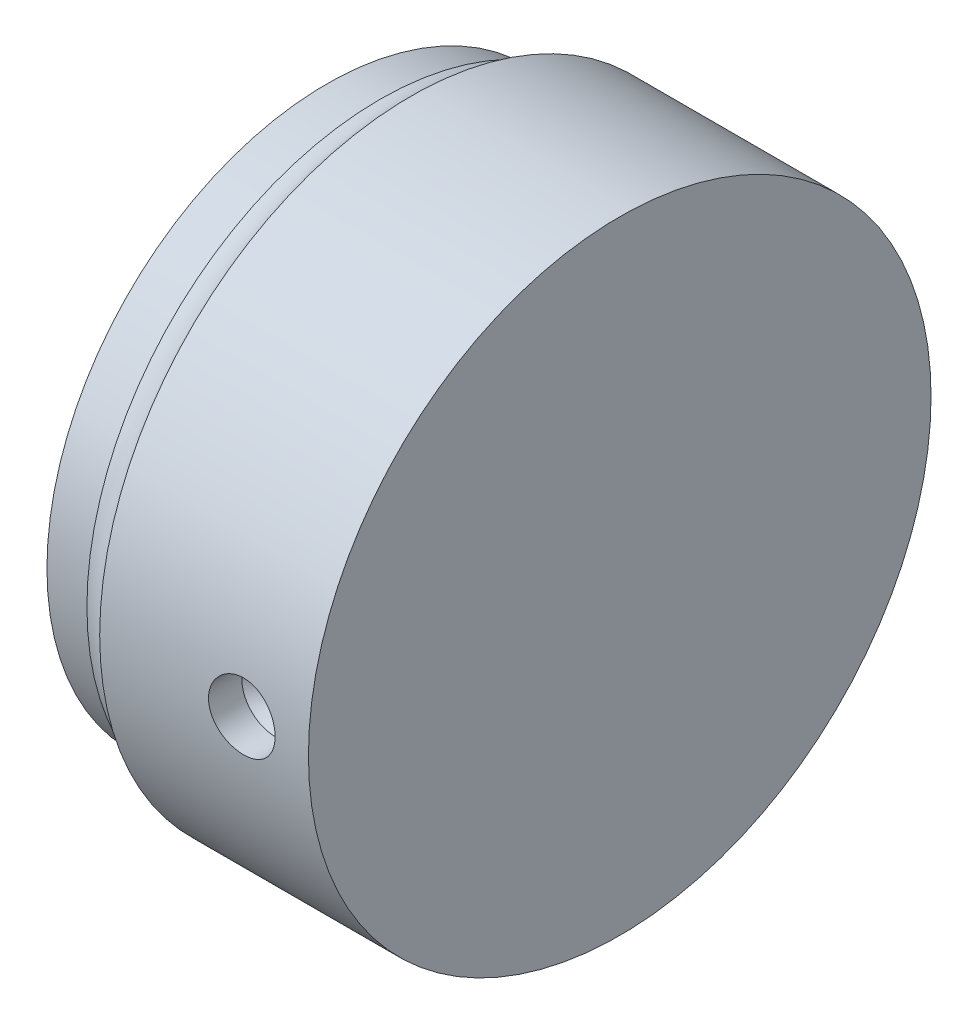
ISO-10303-21;
HEADER;
FILE_DESCRIPTION(('STEP AP214'),'2;1');
FILE_NAME('part.step','',(''),(''),'','','');
FILE_SCHEMA(('AUTOMOTIVE_DESIGN { 1 0 10303 214 1 1 1 1 }'));
ENDSEC;
DATA;
#1=APPLICATION_CONTEXT('core data for automotive mechanical design processes');
#2=APPLICATION_PROTOCOL_DEFINITION('international standard','automotive_design',2000,#1);
#3=PRODUCT_CONTEXT('',#1,'mechanical');
#4=PRODUCT('Part','Part','',(#3));
#5=PRODUCT_RELATED_PRODUCT_CATEGORY('part','',(#4));
#6=PRODUCT_DEFINITION_FORMATION('','',#4);
#7=PRODUCT_DEFINITION_CONTEXT('part definition',#1,'design');
#8=PRODUCT_DEFINITION('design','',#6,#7);
#9=PRODUCT_DEFINITION_SHAPE('','',#8);
#10=(LENGTH_UNIT() NAMED_UNIT(*) SI_UNIT(.MILLI.,.METRE.));
#11=(NAMED_UNIT(*) PLANE_ANGLE_UNIT() SI_UNIT($,.RADIAN.));
#12=(NAMED_UNIT(*) SI_UNIT($,.STERADIAN.) SOLID_ANGLE_UNIT());
#13=UNCERTAINTY_MEASURE_WITH_UNIT(LENGTH_MEASURE(1.E-05),#10,'distance_accuracy_value','');
#14=(GEOMETRIC_REPRESENTATION_CONTEXT(3) GLOBAL_UNCERTAINTY_ASSIGNED_CONTEXT((#13)) GLOBAL_UNIT_ASSIGNED_CONTEXT((#10,
#11,#12)) REPRESENTATION_CONTEXT('',''));
#15=CARTESIAN_POINT('',(0.,0.,0.));
#16=DIRECTION('',(0.,0.,1.));
#17=DIRECTION('',(1.,0.,0.));
#18=AXIS2_PLACEMENT_3D('',#15,#16,#17);
#19=CARTESIAN_POINT('',(-18.2792244551209,0.,-46.7421297434366));
#20=DIRECTION('',(0.,0.,1.00000000000003));
#21=DIRECTION('',(1.,0.,0.));
#22=AXIS2_PLACEMENT_3D('',#19,#20,#21);
#23=CYLINDRICAL_SURFACE('',#22,2.5);
#24=CARTESIAN_POINT('',(-18.2792244551209,0.,39.2411297434375));
#25=DIRECTION('',(0.,0.,1.00000000000003));
#26=DIRECTION('',(1.,0.,0.));
#27=AXIS2_PLACEMENT_3D('',#24,#25,#26);
#28=CIRCLE('',#27,2.5);
#29=CARTESIAN_POINT('',(-15.7792244551209,0.,39.2411297434375));
#30=VERTEX_POINT('',#29);
#31=EDGE_CURVE('E11',#30,#30,#28,.T.);
#32=ORIENTED_EDGE('',*,*,#31,.T.);
#33=EDGE_LOOP('',(#32));
#34=FACE_BOUND('',#33,.T.);
#35=CARTESIAN_POINT('',(-15.7792244551209,1.66533453693773E-13,3.00000000000027));
#36=CARTESIAN_POINT('',(-15.7792293406746,0.118757533193332,2.99999522795234));
#37=CARTESIAN_POINT('',(-15.7877469590255,0.237551281104216,2.9928867059475));
#38=CARTESIAN_POINT('',(-15.8211871784727,0.471182492492846,2.9651076286826));
#39=CARTESIAN_POINT('',(-15.8461219290961,0.586016959612439,2.94442702942004));
#40=CARTESIAN_POINT('',(-15.9105365724535,0.807829942407299,2.89142690238867));
#41=CARTESIAN_POINT('',(-15.9499295294746,0.914850920904895,2.8591769655007));
#42=CARTESIAN_POINT('',(-16.0412415030635,1.11984139043407,2.78529176182902));
#43=CARTESIAN_POINT('',(-16.0931647517941,1.21780780775233,2.74365332434936));
#44=CARTESIAN_POINT('',(-16.228678204929,1.43789998519766,2.63674191529867));
#45=CARTESIAN_POINT('',(-16.3168946593031,1.55568219657217,2.56840549256193));
#46=CARTESIAN_POINT('',(-16.5097487808722,1.77202398328145,2.42422624777675));
#47=CARTESIAN_POINT('',(-16.6144320243639,1.87052845158605,2.34836281453276));
#48=CARTESIAN_POINT('',(-16.7833087316119,2.00437263805587,2.23294886313739));
#49=CARTESIAN_POINT('',(-16.8421800313122,2.04699726278813,2.19383679994999));
#50=CARTESIAN_POINT('',(-16.9637300580814,2.12715295529551,2.11620611809196));
#51=CARTESIAN_POINT('',(-17.0264100499916,2.16468231743737,2.07768770195026));
#52=CARTESIAN_POINT('',(-17.1554917794565,2.23441122570744,2.00250543288664));
#53=CARTESIAN_POINT('',(-17.2218842398457,2.26662332666224,1.96583735754653));
#54=CARTESIAN_POINT('',(-17.3586707390493,2.3255369061279,1.89577686630314));
#55=CARTESIAN_POINT('',(-17.4290613024627,2.3522430799868,1.86238167220906));
#56=CARTESIAN_POINT('',(-17.580891545321,2.40193513934005,1.79791918980413));
#57=CARTESIAN_POINT('',(-17.6627485478443,2.42433807692595,1.76736311251005));
#58=CARTESIAN_POINT('',(-17.831114223934,2.461013136755,1.71593180556008));
#59=CARTESIAN_POINT('',(-17.9176110417355,2.47530499393794,1.69503310194203));
#60=CARTESIAN_POINT('',(-18.0949898635003,2.4948107279905,1.6662092896885));
#61=CARTESIAN_POINT('',(-18.1859124141915,2.49991205058666,1.65844510563097));
#62=CARTESIAN_POINT('',(-18.3677870681236,2.50008569371187,1.65818308531828));
#63=CARTESIAN_POINT('',(-18.4587391717362,2.49515788278403,1.66568544916942));
#64=CARTESIAN_POINT('',(-18.644749165948,2.47505262029594,1.695416394645));
#65=CARTESIAN_POINT('',(-18.7395182008379,2.4590557711333,1.71881932066469));
#66=CARTESIAN_POINT('',(-18.923435436323,2.41742550503025,1.77688235738916));
#67=CARTESIAN_POINT('',(-19.0125638258357,2.39176011044289,1.81157977103025));
#68=CARTESIAN_POINT('',(-19.1670515336619,2.33816270346873,1.88002226126138));
#69=CARTESIAN_POINT('',(-19.2335366975325,2.31177513033565,1.9125031684544));
#70=CARTESIAN_POINT('',(-19.3628752619008,2.25404424958635,1.9802199666153));
#71=CARTESIAN_POINT('',(-19.4257265029867,2.22269803586305,2.01545746697786));
#72=CARTESIAN_POINT('',(-19.6091912961405,2.12149677560465,2.12342648109725));
#73=CARTESIAN_POINT('',(-19.7246386027269,2.04450664231777,2.19837696967439));
#74=CARTESIAN_POINT('',(-19.9474914175752,1.86765914501414,2.35079897952278));
#75=CARTESIAN_POINT('',(-20.0541627791127,1.76681805277627,2.42819792618943));
#76=CARTESIAN_POINT('',(-20.2503367999382,1.54484388336148,2.57509054043287));
#77=CARTESIAN_POINT('',(-20.3398764881771,1.42375565615775,2.64460112267372));
#78=CARTESIAN_POINT('',(-20.4786392942194,1.19411179169417,2.75428914126554));
#79=CARTESIAN_POINT('',(-20.5323673533085,1.08972732107277,2.79748350073997));
#80=CARTESIAN_POINT('',(-20.6255672003762,0.871071458330355,2.873078040198));
#81=CARTESIAN_POINT('',(-20.6650478867014,0.756806292780753,2.90548495660805));
#82=CARTESIAN_POINT('',(-20.7276417050531,0.519954301215411,2.95709834265566));
#83=CARTESIAN_POINT('',(-20.7506284017784,0.3973109231253,2.97620280955844));
#84=CARTESIAN_POINT('',(-20.777933687048,0.148559976923719,2.99891434528972));
#85=CARTESIAN_POINT('',(-20.782264765971,0.0224547835239927,3.00253178304178));
#86=CARTESIAN_POINT('',(-20.7725620156771,-0.213310199456587,2.99444999039147));
#87=CARTESIAN_POINT('',(-20.7606658164057,-0.323130540835874,2.98453350716311));
#88=CARTESIAN_POINT('',(-20.7229575049094,-0.53864496440062,2.95325589460136));
#89=CARTESIAN_POINT('',(-20.6971437234019,-0.644338549989575,2.931893392428));
#90=CARTESIAN_POINT('',(-20.6326010596656,-0.850565499199269,2.8788952154619));
#91=CARTESIAN_POINT('',(-20.5937036656766,-0.951010682223329,2.84712564891975));
#92=CARTESIAN_POINT('',(-20.5048288227842,-1.14365900898104,2.77536124733888));
#93=CARTESIAN_POINT('',(-20.4548472781276,-1.23585908831209,2.73536337221809));
#94=CARTESIAN_POINT('',(-20.3207926597739,-1.45067439735099,2.62975152158595));
#95=CARTESIAN_POINT('',(-20.2314918718536,-1.56834359540732,2.56070244234713));
#96=CARTESIAN_POINT('',(-20.0363840724652,-1.7842899474085,2.41522445403189));
#97=CARTESIAN_POINT('',(-19.9305259997661,-1.88250490855174,2.33877300422836));
#98=CARTESIAN_POINT('',(-19.7598124871922,-2.01573314784292,2.222698055986));
#99=CARTESIAN_POINT('',(-19.7003261821449,-2.05811069143951,2.18341151736028));
#100=CARTESIAN_POINT('',(-19.5775036390886,-2.13771669597408,2.10553153817178));
#101=CARTESIAN_POINT('',(-19.5141660274568,-2.17494330406757,2.06693835133605));
#102=CARTESIAN_POINT('',(-19.3837360512057,-2.2439885702676,1.99176108482637));
#103=CARTESIAN_POINT('',(-19.3166542305873,-2.27582148781541,1.95517188634208));
#104=CARTESIAN_POINT('',(-19.178434350621,-2.33388856739462,1.88547561448177));
#105=CARTESIAN_POINT('',(-19.1073000847015,-2.36012785984656,1.85236536450792));
#106=CARTESIAN_POINT('',(-18.9549540867689,-2.40837357148323,1.78925557416049));
#107=CARTESIAN_POINT('',(-18.8733900040471,-2.42988314318547,1.7597071178665));
#108=CARTESIAN_POINT('',(-18.7057725011783,-2.46482255689516,1.71043063887423));
#109=CARTESIAN_POINT('',(-18.619730883793,-2.47827257713357,1.69067811225259));
#110=CARTESIAN_POINT('',(-18.4435868477085,-2.49617289535263,1.66415315979461));
#111=CARTESIAN_POINT('',(-18.3534491253702,-2.50051799183962,1.65753251048388));
#112=CARTESIAN_POINT('',(-18.1733712423369,-2.49938197104458,1.65924308630663));
#113=CARTESIAN_POINT('',(-18.0834311399957,-2.49389826274012,1.66757825402154));
#114=CARTESIAN_POINT('',(-17.8975518797303,-2.4726526384854,1.6989289873552));
#115=CARTESIAN_POINT('',(-17.8019941845882,-2.45585812550763,1.72341371023855));
#116=CARTESIAN_POINT('',(-17.6166931590381,-2.41250339675094,1.78358728037384));
#117=CARTESIAN_POINT('',(-17.5269702264116,-2.38591088285911,1.81931312531327));
#118=CARTESIAN_POINT('',(-17.371435413766,-2.3305083584492,1.88952619366195));
#119=CARTESIAN_POINT('',(-17.3044806958859,-2.30325853049533,1.9227781662779));
#120=CARTESIAN_POINT('',(-17.1742780686964,-2.24370627018014,1.99195185230568));
#121=CARTESIAN_POINT('',(-17.111032344121,-2.21140090020865,2.02787511150518));
#122=CARTESIAN_POINT('',(-16.9264948937789,-2.10716294428986,2.13775931167912));
#123=CARTESIAN_POINT('',(-16.8104775301289,-2.02793576743753,2.21379780164321));
#124=CARTESIAN_POINT('',(-16.5872171938296,-1.84629697567415,2.36772603763548));
#125=CARTESIAN_POINT('',(-16.4806826610879,-1.74293959593281,2.44552394429513));
#126=CARTESIAN_POINT('',(-16.2853606555815,-1.51553554935621,2.59256498427754));
#127=CARTESIAN_POINT('',(-16.1965338892469,-1.39153583663216,2.66182692543068));
#128=CARTESIAN_POINT('',(-16.0609102583978,-1.15855518141084,2.76942305781508));
#129=CARTESIAN_POINT('',(-16.0091859449014,-1.05399877947694,2.81112174006882));
#130=CARTESIAN_POINT('',(-15.9200057848823,-0.835439786054368,2.88361460666453));
#131=CARTESIAN_POINT('',(-15.8825309310255,-0.721450026753917,2.91442331323772));
#132=CARTESIAN_POINT('',(-15.8290359992943,-0.506620038886833,2.95858745904689));
#133=CARTESIAN_POINT('',(-15.8104493328941,-0.40684546876186,2.97402142398105));
#134=CARTESIAN_POINT('',(-15.7855420868828,-0.204722725654112,2.99472922794416));
#135=CARTESIAN_POINT('',(-15.7792202435339,-0.102374818922637,3.00000411373967));
#136=CARTESIAN_POINT('',(-15.7792244551209,1.66533453693773E-13,3.00000000000027));
#137=B_SPLINE_CURVE_WITH_KNOTS('',3,(#35,#36,#37,#38,#39,#40,#41,#42,#43,#44,#45,#46,#47,#48,
#49,#50,#51,#52,#53,#54,#55,#56,#57,#58,#59,#60,#61,#62,#63,#64,#65,#66,#67,#68,#69,#70,#71,#72,
#73,#74,#75,#76,#77,#78,#79,#80,#81,#82,#83,#84,#85,#86,#87,#88,#89,#90,#91,#92,#93,#94,#95,#96,
#97,#98,#99,#100,#101,#102,#103,#104,#105,#106,#107,#108,#109,#110,#111,#112,#113,#114,#115,
#116,#117,#118,#119,#120,#121,#122,#123,#124,#125,#126,#127,#128,#129,#130,#131,#132,#133,#134,
#135,#136),.UNSPECIFIED.,.T.,.F.,(4,2,2,2,2,2,2,2,2,2,2,2,2,2,2,2,2,2,2,2,2,2,2,2,2,2,2,2,2,2,2,
2,2,2,2,2,2,2,2,2,2,2,2,2,2,2,2,2,2,2,4),(0.,0.355841276815023,0.711946191026804,
1.06594405359536,1.420061648301,1.90425178760109,2.38980643116757,2.63722280423431,
2.88472179650707,3.1316277794366,3.37832232674657,3.64812890035737,3.9172761661685,
4.18969776924956,4.46212294312028,4.75723524199701,5.05333228584547,5.28870178855673,
5.52420974868612,5.9954933935896,6.49137310548251,6.98616858956848,7.36002155957556,
7.73364063000457,8.11009395319702,8.48629519274342,8.81743460677907,9.14861374669853,
9.48423297747587,9.81997643164414,10.3065635514454,10.7946819775665,11.0432812121086,
11.2919696391637,11.5399899810634,11.7877818528618,12.0551105531684,12.3217671309315,
12.5914881373797,12.861280256845,13.159810138375,13.459333028346,13.6977271411685,
13.9362602949127,14.4135864576437,14.9143001108859,15.4138899995708,15.7841228897597,
16.1538601797495,16.4606444271243,16.7673970625124),.UNSPECIFIED.);
#138=CARTESIAN_POINT('',(-15.7792244551209,1.66533453693773E-13,3.00000000000027));
#139=VERTEX_POINT('',#138);
#140=EDGE_CURVE('E53',#139,#139,#137,.T.);
#141=ORIENTED_EDGE('',*,*,#140,.F.);
#142=EDGE_LOOP('',(#141));
#143=FACE_BOUND('',#142,.T.);
#144=ADVANCED_FACE('F38',(#34,#143),#23,.F.);
#145=CARTESIAN_POINT('',(-82.1238408767674,0.,0.));
#146=DIRECTION('',(-1.,0.,0.));
#147=DIRECTION('',(0.,0.,1.00000000000003));
#148=AXIS2_PLACEMENT_3D('',#145,#146,#147);
#149=CYLINDRICAL_SURFACE('',#148,3.);
#150=CARTESIAN_POINT('',(-48.8377658370145,0.,0.));
#151=DIRECTION('',(-1.,0.,0.));
#152=DIRECTION('',(0.,0.,1.00000000000003));
#153=AXIS2_PLACEMENT_3D('',#150,#151,#152);
#154=CIRCLE('',#153,3.);
#155=CARTESIAN_POINT('',(-48.8377658370145,0.,3.00000000000008));
#156=VERTEX_POINT('',#155);
#157=EDGE_CURVE('E58',#156,#156,#154,.T.);
#158=ORIENTED_EDGE('',*,*,#157,.T.);
#159=EDGE_LOOP('',(#158));
#160=FACE_BOUND('',#159,.T.);
#161=CARTESIAN_POINT('',(-15.7792244551209,0.,0.));
#162=DIRECTION('',(-1.,0.,0.));
#163=DIRECTION('',(0.,0.,1.00000000000003));
#164=AXIS2_PLACEMENT_3D('',#161,#162,#163);
#165=CIRCLE('',#164,3.);
#166=EDGE_CURVE('E120',#139,#139,#165,.T.);
#167=ORIENTED_EDGE('',*,*,#166,.F.);
#168=ORIENTED_EDGE('',*,*,#140,.T.);
#169=EDGE_LOOP('',(#167,#168));
#170=FACE_BOUND('',#169,.T.);
#171=ADVANCED_FACE('F131',(#160,#170),#149,.F.);
#172=CARTESIAN_POINT('',(-15.7792244551209,-3.00000000000002,0.));
#173=DIRECTION('',(-1.,0.,0.));
#174=DIRECTION('',(0.,0.,1.00000000000003));
#175=AXIS2_PLACEMENT_3D('',#172,#173,#174);
#176=PLANE('',#175);
#177=ORIENTED_EDGE('',*,*,#166,.T.);
#178=EDGE_LOOP('',(#177));
#179=FACE_BOUND('',#178,.T.);
#180=ADVANCED_FACE('F136',(#179),#176,.T.);
#181=CARTESIAN_POINT('',(-8.27922445512086,-46.7411297434376,0.));
#182=DIRECTION('',(1.,0.,0.));
#183=DIRECTION('',(0.,0.,-1.00000000000003));
#184=AXIS2_PLACEMENT_3D('',#181,#182,#183);
#185=PLANE('',#184);
#186=CARTESIAN_POINT('',(-8.27922445512086,0.,0.));
#187=DIRECTION('',(-1.,0.,0.));
#188=DIRECTION('',(0.,0.,1.00000000000003));
#189=AXIS2_PLACEMENT_3D('',#186,#187,#188);
#190=CIRCLE('',#189,46.7411297434362);
#191=CARTESIAN_POINT('',(-8.27922445512086,0.,46.7411297434375));
#192=VERTEX_POINT('',#191);
#193=EDGE_CURVE('E147',#192,#192,#190,.T.);
#194=ORIENTED_EDGE('',*,*,#193,.F.);
#195=EDGE_LOOP('',(#194));
#196=FACE_BOUND('',#195,.T.);
#197=ADVANCED_FACE('F111',(#196),#185,.T.);
#198=CARTESIAN_POINT('',(-82.1238408767674,0.,0.));
#199=DIRECTION('',(-1.,0.,0.));
#200=DIRECTION('',(0.,0.,1.00000000000003));
#201=AXIS2_PLACEMENT_3D('',#198,#199,#200);
#202=CYLINDRICAL_SURFACE('',#201,46.7411297434362);
#203=CARTESIAN_POINT('',(-13.2792244551209,0.,46.7411297434379));
#204=CARTESIAN_POINT('',(-13.2792230203443,0.140046413609272,46.74113015908));
#205=CARTESIAN_POINT('',(-13.2851105440674,0.280071147177755,46.7404990668055));
#206=CARTESIAN_POINT('',(-13.3086165502816,0.55916608378932,46.7379932169076));
#207=CARTESIAN_POINT('',(-13.326237806671,0.698236053266582,46.736118165208));
#208=CARTESIAN_POINT('',(-13.3731044077806,0.974490815400754,46.7311746362577));
#209=CARTESIAN_POINT('',(-13.4023588632388,1.11167404309637,46.7281052236635));
#210=CARTESIAN_POINT('',(-13.4722895086343,1.38312196762976,46.7208585567794));
#211=CARTESIAN_POINT('',(-13.5129698795257,1.51738557671226,46.7166808969924));
#212=CARTESIAN_POINT('',(-13.6054055038236,1.78185855269436,46.7073407835085));
#213=CARTESIAN_POINT('',(-13.6571497037872,1.91207181848845,46.7021793132532));
#214=CARTESIAN_POINT('',(-13.7713849000619,2.16771552407885,46.6910119482864));
#215=CARTESIAN_POINT('',(-13.8338798536818,2.29314418183538,46.6850057427804));
#216=CARTESIAN_POINT('',(-13.9691182460588,2.53822012972528,46.6723226126573));
#217=CARTESIAN_POINT('',(-14.0418558632401,2.65787065242965,46.6656460696514));
#218=CARTESIAN_POINT('',(-14.1971201448733,2.89067606121647,46.6518038962686));
#219=CARTESIAN_POINT('',(-14.2796504278616,3.00382852310543,46.6446380855179));
#220=CARTESIAN_POINT('',(-14.4541840560331,3.22316186458556,46.62999635295));
#221=CARTESIAN_POINT('',(-14.5462175289403,3.32931870842726,46.6225194927118));
#222=CARTESIAN_POINT('',(-14.7389208041272,3.53354900490656,46.6074857927376));
#223=CARTESIAN_POINT('',(-14.8395937865703,3.63161945470865,46.5999289244561));
#224=CARTESIAN_POINT('',(-15.0488076928383,3.81891524238186,46.5849538172105));
#225=CARTESIAN_POINT('',(-15.1573460833703,3.90814340645076,46.5775355345705));
#226=CARTESIAN_POINT('',(-15.381601150882,4.07719312845327,46.5630422991519));
#227=CARTESIAN_POINT('',(-15.4973204617366,4.15701120337874,46.5559674740657));
#228=CARTESIAN_POINT('',(-15.735338419928,4.3067917628591,46.5423508682022));
#229=CARTESIAN_POINT('',(-15.8576502269183,4.37673344375302,46.5358102244859));
#230=CARTESIAN_POINT('',(-16.1078119661261,4.50608553565642,46.5234631756046));
#231=CARTESIAN_POINT('',(-16.2356639338857,4.5654920343427,46.5176570434346));
#232=CARTESIAN_POINT('',(-16.4959190397962,4.67329019684596,46.5069512156073));
#233=CARTESIAN_POINT('',(-16.6283203750029,4.72168616755555,46.5020511656666));
#234=CARTESIAN_POINT('',(-16.8967770223945,4.80715314399706,46.4932931270844));
#235=CARTESIAN_POINT('',(-17.032833659083,4.84421998270977,46.4894355219296));
#236=CARTESIAN_POINT('',(-17.443880323663,4.93768677915582,46.4796364068665));
#237=CARTESIAN_POINT('',(-17.7230447955679,4.97688882031112,46.47541354294));
#238=CARTESIAN_POINT('',(-18.2838681668589,5.00789000004657,46.4720825548048));
#239=CARTESIAN_POINT('',(-18.5655269915457,4.9996905534172,46.4729742779413));
#240=CARTESIAN_POINT('',(-19.12229523293,4.93633066548453,46.4797466141888));
#241=CARTESIAN_POINT('',(-19.3974270086031,4.88136558645875,46.4856064726782));
#242=CARTESIAN_POINT('',(-19.9345274794356,4.72632231493534,46.5016247586994));
#243=CARTESIAN_POINT('',(-20.1964959736915,4.62624343412398,46.5117832518165));
#244=CARTESIAN_POINT('',(-20.7004614902509,4.38360361443996,46.5352773932912));
#245=CARTESIAN_POINT('',(-20.9424166842323,4.24095643603347,46.5486194802202));
#246=CARTESIAN_POINT('',(-21.3990258920845,3.91728996001473,46.5769723545321));
#247=CARTESIAN_POINT('',(-21.6136789907085,3.73626937655486,46.5919831978251));
#248=CARTESIAN_POINT('',(-22.0107269799966,3.33990563375068,46.6220746799998));
#249=CARTESIAN_POINT('',(-22.1929535231951,3.12439379082965,46.6371552886082));
#250=CARTESIAN_POINT('',(-22.5186690468399,2.66574949524364,46.6656157288284));
#251=CARTESIAN_POINT('',(-22.6621579737669,2.42261700441913,46.6789955580905));
#252=CARTESIAN_POINT('',(-22.9063202178379,1.91551304791336,46.7025522251377));
#253=CARTESIAN_POINT('',(-23.0069844804119,1.65153718921947,46.7127283854416));
#254=CARTESIAN_POINT('',(-23.1625138818436,1.1102970620296,46.7287244626053));
#255=CARTESIAN_POINT('',(-23.2173805886302,0.833033248804805,46.7345445286));
#256=CARTESIAN_POINT('',(-23.2795426641185,0.27454502684111,46.7411534424039));
#257=CARTESIAN_POINT('',(-23.2870702374065,-0.00665325788371744,46.7419668481125));
#258=CARTESIAN_POINT('',(-23.2549509865042,-0.566307349666804,46.7385367604656));
#259=CARTESIAN_POINT('',(-23.2153048933665,-0.844763199157292,46.7342933454758));
#260=CARTESIAN_POINT('',(-23.090156450325,-1.39035403371341,46.7212420171899));
#261=CARTESIAN_POINT('',(-23.0047633372874,-1.65751435788458,46.7124449789305));
#262=CARTESIAN_POINT('',(-22.7906573744155,-2.1737193780374,46.6912727567755));
#263=CARTESIAN_POINT('',(-22.6619434217868,-2.42276361265163,46.6788974817919));
#264=CARTESIAN_POINT('',(-22.3642775138703,-2.89671362407117,46.6518905901918));
#265=CARTESIAN_POINT('',(-22.1951736014596,-3.12152347409233,46.6372505279855));
#266=CARTESIAN_POINT('',(-21.8217441397732,-3.53965079905737,46.6073825407418));
#267=CARTESIAN_POINT('',(-21.6174175761597,-3.73296736674937,46.5921545987845));
#268=CARTESIAN_POINT('',(-21.1783309277152,-4.08343174898844,46.56275265198));
#269=CARTESIAN_POINT('',(-20.9434485460037,-4.24042676883657,46.5485832633947));
#270=CARTESIAN_POINT('',(-20.4505043837288,-4.51273842314788,46.5229748947211));
#271=CARTESIAN_POINT('',(-20.1924429593454,-4.62805569791425,46.5115358726865));
#272=CARTESIAN_POINT('',(-19.6610346512601,-4.81349004337869,46.4927116252019));
#273=CARTESIAN_POINT('',(-19.3877192748963,-4.88369679045687,46.4853183614547));
#274=CARTESIAN_POINT('',(-18.8329421323527,-4.97718803916417,46.475403393992));
#275=CARTESIAN_POINT('',(-18.5514806370075,-5.00047409895546,46.4728815285051));
#276=CARTESIAN_POINT('',(-18.1303504231301,-4.999752107382,46.4729551964035));
#277=CARTESIAN_POINT('',(-17.9904300129126,-4.99361732589696,46.473617336687));
#278=CARTESIAN_POINT('',(-17.7116209685283,-4.96964431945618,46.4761876988026));
#279=CARTESIAN_POINT('',(-17.5727319704098,-4.95181044264081,46.478095457681));
#280=CARTESIAN_POINT('',(-17.2969191604922,-4.90455613288549,46.483105464081));
#281=CARTESIAN_POINT('',(-17.1599960865543,-4.87513146166613,46.4862081485287));
#282=CARTESIAN_POINT('',(-16.8891740699763,-4.80492639669859,46.4935171609794));
#283=CARTESIAN_POINT('',(-16.7552740422766,-4.76415014973694,46.4977230859308));
#284=CARTESIAN_POINT('',(-16.4913709735298,-4.6715244401272,46.5071202492684));
#285=CARTESIAN_POINT('',(-16.3613686130046,-4.61967305648212,46.5123116585706));
#286=CARTESIAN_POINT('',(-16.1062427331376,-4.50529532849784,46.5235297722887));
#287=CARTESIAN_POINT('',(-15.9811174545894,-4.44277287790752,46.5295561718758));
#288=CARTESIAN_POINT('',(-15.7365247490259,-4.30746085792342,46.5422776365215));
#289=CARTESIAN_POINT('',(-15.6170593612247,-4.23466762506402,46.5489729399201));
#290=CARTESIAN_POINT('',(-15.3847068810231,-4.07937337373085,46.5628392057232));
#291=CARTESIAN_POINT('',(-15.271817425826,-3.99687587466795,46.5700099952756));
#292=CARTESIAN_POINT('',(-15.0527792181467,-3.82227282938635,46.5846664976171));
#293=CARTESIAN_POINT('',(-14.9466688820059,-3.73011920727577,46.5921536635715));
#294=CARTESIAN_POINT('',(-14.7426189046681,-3.53724795428718,46.6071929720919));
#295=CARTESIAN_POINT('',(-14.6446763008613,-3.436533455623,46.6147450899922));
#296=CARTESIAN_POINT('',(-14.4575481454046,-3.22715296781262,46.6297084824658));
#297=CARTESIAN_POINT('',(-14.3683679460477,-3.11848218862395,46.6371196687533));
#298=CARTESIAN_POINT('',(-14.199492376144,-2.89404590021772,46.6515846032877));
#299=CARTESIAN_POINT('',(-14.1197935150335,-2.77828302588864,46.6586384825249));
#300=CARTESIAN_POINT('',(-13.9701671306911,-2.54005381137165,46.672214573595));
#301=CARTESIAN_POINT('',(-13.9002718663978,-2.41756710432839,46.6787350020674));
#302=CARTESIAN_POINT('',(-13.7710848866595,-2.16714586288969,46.6910312275995));
#303=CARTESIAN_POINT('',(-13.7117892862395,-2.03921334585949,46.6968072972632));
#304=CARTESIAN_POINT('',(-13.6042437893461,-1.77886857530252,46.7074489726955));
#305=CARTESIAN_POINT('',(-13.5559849561293,-1.64646004655366,46.7123153145062));
#306=CARTESIAN_POINT('',(-13.4708163606539,-1.3780554769891,46.7210039276942));
#307=CARTESIAN_POINT('',(-13.4339038391106,-1.24206031714721,46.7248264528896));
#308=CARTESIAN_POINT('',(-13.3617870122413,-0.923707543405965,46.7323518285172));
#309=CARTESIAN_POINT('',(-13.3308563475063,-0.740355357067599,46.7356303077072));
#310=CARTESIAN_POINT('',(-13.2895760701998,-0.371322741167455,46.7400189843854));
#311=CARTESIAN_POINT('',(-13.2792263570278,-0.185642322990642,46.7411291924721));
#312=CARTESIAN_POINT('',(-13.2792244551209,0.,46.7411297434379));
#313=B_SPLINE_CURVE_WITH_KNOTS('',3,(#203,#204,#205,#206,#207,#208,#209,#210,#211,#212,#213,
#214,#215,#216,#217,#218,#219,#220,#221,#222,#223,#224,#225,#226,#227,#228,#229,#230,#231,#232,
#233,#234,#235,#236,#237,#238,#239,#240,#241,#242,#243,#244,#245,#246,#247,#248,#249,#250,#251,
#252,#253,#254,#255,#256,#257,#258,#259,#260,#261,#262,#263,#264,#265,#266,#267,#268,#269,#270,
#271,#272,#273,#274,#275,#276,#277,#278,#279,#280,#281,#282,#283,#284,#285,#286,#287,#288,#289,
#290,#291,#292,#293,#294,#295,#296,#297,#298,#299,#300,#301,#302,#303,#304,#305,#306,#307,#308,
#309,#310,#311,#312),.UNSPECIFIED.,.T.,.F.,(4,2,2,2,2,2,2,2,2,2,2,2,2,2,2,2,2,2,2,2,2,2,2,2,2,2,
2,2,2,2,2,2,2,2,2,2,2,2,2,2,2,2,2,2,2,2,2,2,2,2,2,2,2,2,4),(0.,0.419976871235429,
0.840053061838162,1.26045889224637,1.68101875779834,2.10116040527954,2.52145703740949,
2.94151574447517,3.36173015574395,3.78332023453262,4.20506616982567,4.62667686767921,
5.04844313191625,5.47108496045032,5.89388341319645,6.31651619810374,6.73930424692953,
7.58071890104401,8.42210844161554,9.26000025911792,10.0979048609997,10.9375186413682,
11.7771605606544,12.6210419234724,13.4649244521756,14.3089853173712,15.1530172840447,
15.9929059142876,16.8327815289039,17.6706605304795,18.5085608630844,19.3496646687234,
20.1907927004212,21.0353972717054,21.8799888666159,22.722896238683,23.5657756186612,
23.9855363770971,24.4051412136125,24.8248996250929,25.2445048975207,25.6641830102216,
26.0837083133495,26.5033836362297,26.9229072235381,27.3446288701299,27.7661968778913,
28.1880208095206,28.6096889625196,29.0327136110675,29.4555828938404,29.8781085469182,
30.3005313654624,30.8572458222675,31.4139575578211),.UNSPECIFIED.);
#314=CARTESIAN_POINT('',(-13.2792244551209,0.,46.7411297434379));
#315=VERTEX_POINT('',#314);
#316=EDGE_CURVE('E46',#315,#315,#313,.T.);
#317=ORIENTED_EDGE('',*,*,#316,.F.);
#318=EDGE_LOOP('',(#317));
#319=FACE_BOUND('',#318,.T.);
#320=ORIENTED_EDGE('',*,*,#193,.T.);
#321=EDGE_LOOP('',(#320));
#322=FACE_BOUND('',#321,.T.);
#323=CARTESIAN_POINT('',(-39.6212376358394,0.,0.));
#324=DIRECTION('',(-1.,0.,0.));
#325=DIRECTION('',(0.,0.,1.00000000000003));
#326=AXIS2_PLACEMENT_3D('',#323,#324,#325);
#327=CIRCLE('',#326,46.7411297434362);
#328=CARTESIAN_POINT('',(-39.6212376358394,0.,46.7411297434375));
#329=VERTEX_POINT('',#328);
#330=EDGE_CURVE('E151',#329,#329,#327,.T.);
#331=ORIENTED_EDGE('',*,*,#330,.F.);
#332=EDGE_LOOP('',(#331));
#333=FACE_BOUND('',#332,.T.);
#334=ADVANCED_FACE('F106',(#319,#322,#333),#202,.T.);
#335=CARTESIAN_POINT('',(-44.2792244551208,0.,0.));
#336=DIRECTION('',(-1.,0.,0.));
#337=DIRECTION('',(0.,0.,1.00000000000003));
#338=AXIS2_PLACEMENT_3D('',#335,#336,#337);
#339=TOROIDAL_SURFACE('',#338,49.3282106673164,5.32821066731638);
#340=ORIENTED_EDGE('',*,*,#330,.T.);
#341=EDGE_LOOP('',(#340));
#342=FACE_BOUND('',#341,.T.);
#343=CARTESIAN_POINT('',(-44.2792244551208,0.,0.));
#344=DIRECTION('',(-1.,0.,0.));
#345=DIRECTION('',(0.,0.,1.00000000000003));
#346=AXIS2_PLACEMENT_3D('',#343,#344,#345);
#347=CIRCLE('',#346,44.);
#348=CARTESIAN_POINT('',(-44.2792244551208,0.,44.0000000000012));
#349=VERTEX_POINT('',#348);
#350=EDGE_CURVE('E157',#349,#349,#347,.T.);
#351=ORIENTED_EDGE('',*,*,#350,.F.);
#352=EDGE_LOOP('',(#351));
#353=FACE_BOUND('',#352,.T.);
#354=ADVANCED_FACE('F102',(#342,#353),#339,.F.);
#355=CARTESIAN_POINT('',(-44.2792244551208,-42.0000000000011,0.));
#356=DIRECTION('',(-1.,0.,0.));
#357=DIRECTION('',(0.,0.,1.00000000000003));
#358=AXIS2_PLACEMENT_3D('',#355,#356,#357);
#359=PLANE('',#358);
#360=ORIENTED_EDGE('',*,*,#350,.T.);
#361=EDGE_LOOP('',(#360));
#362=FACE_BOUND('',#361,.T.);
#363=CARTESIAN_POINT('',(-44.2792244551208,0.,0.));
#364=DIRECTION('',(-1.,0.,0.));
#365=DIRECTION('',(0.,0.,1.00000000000003));
#366=AXIS2_PLACEMENT_3D('',#363,#364,#365);
#367=CIRCLE('',#366,42.);
#368=CARTESIAN_POINT('',(-44.2792244551208,0.,42.0000000000011));
#369=VERTEX_POINT('',#368);
#370=EDGE_CURVE('E163',#369,#369,#367,.T.);
#371=ORIENTED_EDGE('',*,*,#370,.F.);
#372=EDGE_LOOP('',(#371));
#373=FACE_BOUND('',#372,.T.);
#374=ADVANCED_FACE('F98',(#362,#373),#359,.T.);
#375=CARTESIAN_POINT('',(-82.1238408767674,0.,0.));
#376=DIRECTION('',(-1.,0.,0.));
#377=DIRECTION('',(0.,0.,1.00000000000003));
#378=AXIS2_PLACEMENT_3D('',#375,#376,#377);
#379=CYLINDRICAL_SURFACE('',#378,42.);
#380=ORIENTED_EDGE('',*,*,#370,.T.);
#381=EDGE_LOOP('',(#380));
#382=FACE_BOUND('',#381,.T.);
#383=CARTESIAN_POINT('',(-52.2792244551208,0.,0.));
#384=DIRECTION('',(-1.,0.,0.));
#385=DIRECTION('',(0.,0.,1.00000000000003));
#386=AXIS2_PLACEMENT_3D('',#383,#384,#385);
#387=CIRCLE('',#386,42.);
#388=CARTESIAN_POINT('',(-52.2792244551208,0.,42.0000000000011));
#389=VERTEX_POINT('',#388);
#390=EDGE_CURVE('E167',#389,#389,#387,.T.);
#391=ORIENTED_EDGE('',*,*,#390,.F.);
#392=EDGE_LOOP('',(#391));
#393=FACE_BOUND('',#392,.T.);
#394=ADVANCED_FACE('F94',(#382,#393),#379,.T.);
#395=CARTESIAN_POINT('',(-52.2792244551208,-24.7074561328678,1.38777878078145E-13));
#396=DIRECTION('',(-1.,0.,0.));
#397=DIRECTION('',(0.,0.,1.00000000000003));
#398=AXIS2_PLACEMENT_3D('',#395,#396,#397);
#399=PLANE('',#398);
#400=ORIENTED_EDGE('',*,*,#390,.T.);
#401=EDGE_LOOP('',(#400));
#402=FACE_BOUND('',#401,.T.);
#403=CARTESIAN_POINT('',(-52.2792244551208,0.,0.));
#404=DIRECTION('',(-1.,0.,0.));
#405=DIRECTION('',(0.,0.,1.00000000000003));
#406=AXIS2_PLACEMENT_3D('',#403,#404,#405);
#407=CIRCLE('',#406,24.707456132867);
#408=CARTESIAN_POINT('',(-52.2792244551208,0.,24.7074561328676));
#409=VERTEX_POINT('',#408);
#410=EDGE_CURVE('E171',#409,#409,#407,.T.);
#411=ORIENTED_EDGE('',*,*,#410,.F.);
#412=EDGE_LOOP('',(#411));
#413=FACE_BOUND('',#412,.T.);
#414=ADVANCED_FACE('F90',(#402,#413),#399,.T.);
#415=CARTESIAN_POINT('',(-50.5584951460677,0.,0.));
#416=DIRECTION('',(-1.,0.,0.));
#417=DIRECTION('',(0.,0.,1.00000000000003));
#418=AXIS2_PLACEMENT_3D('',#415,#416,#417);
#419=CONICAL_SURFACE('',#418,22.25,0.959931088596878);
#420=ORIENTED_EDGE('',*,*,#410,.T.);
#421=EDGE_LOOP('',(#420));
#422=FACE_BOUND('',#421,.T.);
#423=CARTESIAN_POINT('',(-50.5584951460677,0.,0.));
#424=DIRECTION('',(-1.,0.,0.));
#425=DIRECTION('',(0.,0.,1.00000000000003));
#426=AXIS2_PLACEMENT_3D('',#423,#424,#425);
#427=CIRCLE('',#426,22.25);
#428=CARTESIAN_POINT('',(-50.5584951460677,0.,22.2500000000006));
#429=VERTEX_POINT('',#428);
#430=EDGE_CURVE('E175',#429,#429,#427,.T.);
#431=ORIENTED_EDGE('',*,*,#430,.F.);
#432=EDGE_LOOP('',(#431));
#433=FACE_BOUND('',#432,.T.);
#434=ADVANCED_FACE('F86',(#422,#433),#419,.F.);
#435=CARTESIAN_POINT('',(-50.5584951460677,-5.45745613286697,0.));
#436=DIRECTION('',(-1.,0.,0.));
#437=DIRECTION('',(0.,0.,1.00000000000003));
#438=AXIS2_PLACEMENT_3D('',#435,#436,#437);
#439=PLANE('',#438);
#440=ORIENTED_EDGE('',*,*,#430,.T.);
#441=EDGE_LOOP('',(#440));
#442=FACE_BOUND('',#441,.T.);
#443=CARTESIAN_POINT('',(-50.5584951460677,0.,0.));
#444=DIRECTION('',(-1.,0.,0.));
#445=DIRECTION('',(0.,0.,1.00000000000003));
#446=AXIS2_PLACEMENT_3D('',#443,#444,#445);
#447=CIRCLE('',#446,5.45745613286697);
#448=CARTESIAN_POINT('',(-50.5584951460677,0.,5.45745613286712));
#449=VERTEX_POINT('',#448);
#450=EDGE_CURVE('E64',#449,#449,#447,.T.);
#451=ORIENTED_EDGE('',*,*,#450,.F.);
#452=EDGE_LOOP('',(#451));
#453=FACE_BOUND('',#452,.T.);
#454=ADVANCED_FACE('F82',(#442,#453),#439,.T.);
#455=CARTESIAN_POINT('',(-48.8377658370145,0.,0.));
#456=DIRECTION('',(-1.,0.,0.));
#457=DIRECTION('',(0.,0.,1.00000000000003));
#458=AXIS2_PLACEMENT_3D('',#455,#456,#457);
#459=CONICAL_SURFACE('',#458,3.,0.959931088596877);
#460=ORIENTED_EDGE('',*,*,#450,.T.);
#461=EDGE_LOOP('',(#460));
#462=FACE_BOUND('',#461,.T.);
#463=ORIENTED_EDGE('',*,*,#157,.F.);
#464=EDGE_LOOP('',(#463));
#465=FACE_BOUND('',#464,.T.);
#466=ADVANCED_FACE('F78',(#462,#465),#459,.F.);
#467=CARTESIAN_POINT('',(-18.2792244551209,0.,41.7411297434378));
#468=DIRECTION('',(0.,0.,1.00000000000003));
#469=DIRECTION('',(1.,0.,0.));
#470=AXIS2_PLACEMENT_3D('',#467,#468,#469);
#471=CYLINDRICAL_SURFACE('',#470,5.);
#472=ORIENTED_EDGE('',*,*,#316,.T.);
#473=EDGE_LOOP('',(#472));
#474=FACE_BOUND('',#473,.T.);
#475=CARTESIAN_POINT('',(-18.2792244551209,0.,41.7411297434378));
#476=DIRECTION('',(0.,0.,1.00000000000003));
#477=DIRECTION('',(1.,0.,0.));
#478=AXIS2_PLACEMENT_3D('',#475,#476,#477);
#479=CIRCLE('',#478,5.);
#480=CARTESIAN_POINT('',(-13.2792244551209,0.,41.7411297434378));
#481=VERTEX_POINT('',#480);
#482=EDGE_CURVE('E59',#481,#481,#479,.T.);
#483=ORIENTED_EDGE('',*,*,#482,.F.);
#484=EDGE_LOOP('',(#483));
#485=FACE_BOUND('',#484,.T.);
#486=ADVANCED_FACE('F81',(#474,#485),#471,.F.);
#487=CARTESIAN_POINT('',(-18.2792244551209,0.,41.7411297434378));
#488=DIRECTION('',(0.,0.,1.00000000000003));
#489=DIRECTION('',(1.,0.,0.));
#490=AXIS2_PLACEMENT_3D('',#487,#488,#489);
#491=CONICAL_SURFACE('',#490,5.00000000000002,0.785398163397449);
#492=ORIENTED_EDGE('',*,*,#31,.F.);
#493=EDGE_LOOP('',(#492));
#494=FACE_BOUND('',#493,.T.);
#495=ORIENTED_EDGE('',*,*,#482,.T.);
#496=EDGE_LOOP('',(#495));
#497=FACE_BOUND('',#496,.T.);
#498=ADVANCED_FACE('F40',(#494,#497),#491,.F.);
#499=CLOSED_SHELL('',(#144,#171,#180,#197,#334,#354,#374,#394,#414,#434,#454,#466,#486,#498));
#500=MANIFOLD_SOLID_BREP('B2',#499);
#501=ADVANCED_BREP_SHAPE_REPRESENTATION('',(#18,#500),#14);
#502=SHAPE_DEFINITION_REPRESENTATION(#9,#501);
ENDSEC;
END-ISO-10303-21;
